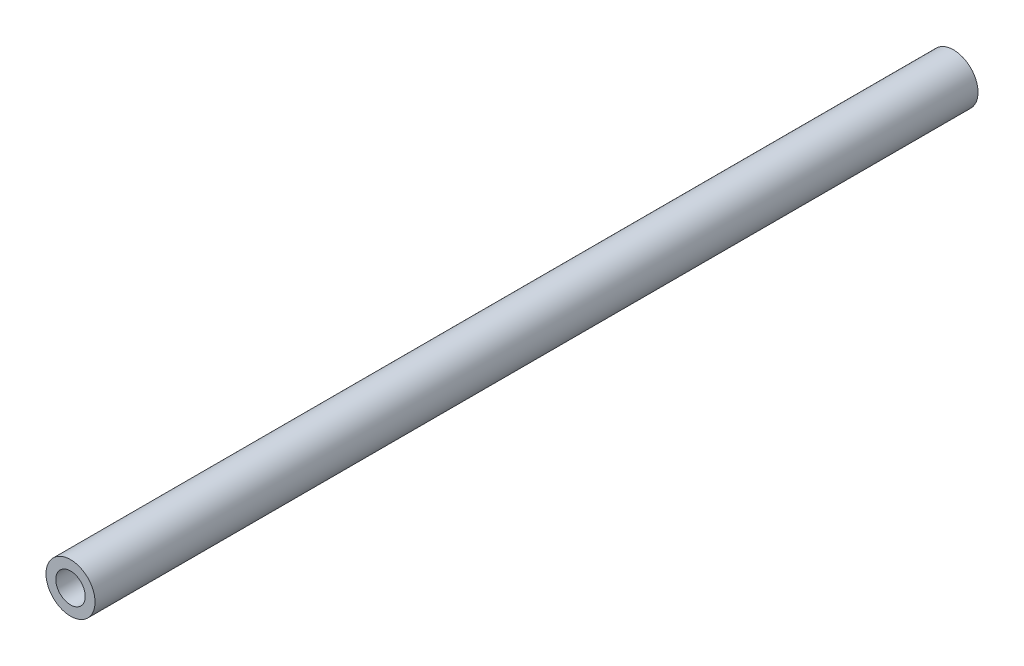
ISO-10303-21;
HEADER;
FILE_DESCRIPTION(('STEP AP214'),'2;1');
FILE_NAME('part.step','',(''),(''),'','','');
FILE_SCHEMA(('AUTOMOTIVE_DESIGN { 1 0 10303 214 1 1 1 1 }'));
ENDSEC;
DATA;
#1=APPLICATION_CONTEXT('core data for automotive mechanical design processes');
#2=APPLICATION_PROTOCOL_DEFINITION('international standard','automotive_design',2000,#1);
#3=PRODUCT_CONTEXT('',#1,'mechanical');
#4=PRODUCT('Part','Part','',(#3));
#5=PRODUCT_RELATED_PRODUCT_CATEGORY('part','',(#4));
#6=PRODUCT_DEFINITION_FORMATION('','',#4);
#7=PRODUCT_DEFINITION_CONTEXT('part definition',#1,'design');
#8=PRODUCT_DEFINITION('design','',#6,#7);
#9=PRODUCT_DEFINITION_SHAPE('','',#8);
#10=(LENGTH_UNIT() NAMED_UNIT(*) SI_UNIT(.MILLI.,.METRE.));
#11=(NAMED_UNIT(*) PLANE_ANGLE_UNIT() SI_UNIT($,.RADIAN.));
#12=(NAMED_UNIT(*) SI_UNIT($,.STERADIAN.) SOLID_ANGLE_UNIT());
#13=UNCERTAINTY_MEASURE_WITH_UNIT(LENGTH_MEASURE(1.E-05),#10,'distance_accuracy_value','');
#14=(GEOMETRIC_REPRESENTATION_CONTEXT(3) GLOBAL_UNCERTAINTY_ASSIGNED_CONTEXT((#13)) GLOBAL_UNIT_ASSIGNED_CONTEXT((#10,
#11,#12)) REPRESENTATION_CONTEXT('',''));
#15=CARTESIAN_POINT('',(0.,0.,0.));
#16=DIRECTION('',(0.,0.,1.));
#17=DIRECTION('',(1.,0.,0.));
#18=AXIS2_PLACEMENT_3D('',#15,#16,#17);
#19=CARTESIAN_POINT('',(0.,0.,90.));
#20=DIRECTION('',(0.,0.,1.));
#21=DIRECTION('',(1.,0.,0.));
#22=AXIS2_PLACEMENT_3D('',#19,#20,#21);
#23=PLANE('',#22);
#24=CARTESIAN_POINT('',(0.,0.,90.));
#25=DIRECTION('',(0.,0.,1.));
#26=DIRECTION('',(1.,0.,0.));
#27=AXIS2_PLACEMENT_3D('',#24,#25,#26);
#28=CIRCLE('',#27,2.5);
#29=CARTESIAN_POINT('',(-2.5,0.,90.));
#30=VERTEX_POINT('',#29);
#31=EDGE_CURVE('E10',#30,#30,#28,.T.);
#32=ORIENTED_EDGE('',*,*,#31,.T.);
#33=EDGE_LOOP('',(#32));
#34=FACE_BOUND('',#33,.T.);
#35=CARTESIAN_POINT('',(0.,0.,90.));
#36=DIRECTION('',(0.,0.,1.));
#37=DIRECTION('',(1.,0.,0.));
#38=AXIS2_PLACEMENT_3D('',#35,#36,#37);
#39=CIRCLE('',#38,1.5);
#40=CARTESIAN_POINT('',(-1.5,0.,90.));
#41=VERTEX_POINT('',#40);
#42=EDGE_CURVE('E51',#41,#41,#39,.T.);
#43=ORIENTED_EDGE('',*,*,#42,.F.);
#44=EDGE_LOOP('',(#43));
#45=FACE_BOUND('',#44,.T.);
#46=ADVANCED_FACE('F40',(#34,#45),#23,.T.);
#47=CARTESIAN_POINT('',(0.,0.,0.));
#48=DIRECTION('',(0.,0.,1.));
#49=DIRECTION('',(1.,0.,0.));
#50=AXIS2_PLACEMENT_3D('',#47,#48,#49);
#51=PLANE('',#50);
#52=CARTESIAN_POINT('',(0.,0.,0.));
#53=DIRECTION('',(0.,0.,1.));
#54=DIRECTION('',(1.,0.,0.));
#55=AXIS2_PLACEMENT_3D('',#52,#53,#54);
#56=CIRCLE('',#55,2.5);
#57=CARTESIAN_POINT('',(-2.5,0.,0.));
#58=VERTEX_POINT('',#57);
#59=EDGE_CURVE('E44',#58,#58,#56,.T.);
#60=ORIENTED_EDGE('',*,*,#59,.F.);
#61=EDGE_LOOP('',(#60));
#62=FACE_BOUND('',#61,.T.);
#63=CARTESIAN_POINT('',(0.,0.,0.));
#64=DIRECTION('',(0.,0.,1.));
#65=DIRECTION('',(1.,0.,0.));
#66=AXIS2_PLACEMENT_3D('',#63,#64,#65);
#67=CIRCLE('',#66,1.5);
#68=CARTESIAN_POINT('',(-1.5,0.,0.));
#69=VERTEX_POINT('',#68);
#70=EDGE_CURVE('E53',#69,#69,#67,.T.);
#71=ORIENTED_EDGE('',*,*,#70,.T.);
#72=EDGE_LOOP('',(#71));
#73=FACE_BOUND('',#72,.T.);
#74=ADVANCED_FACE('F63',(#62,#73),#51,.F.);
#75=CARTESIAN_POINT('',(0.,0.,90.));
#76=DIRECTION('',(0.,0.,-1.));
#77=DIRECTION('',(-1.,0.,0.));
#78=AXIS2_PLACEMENT_3D('',#75,#76,#77);
#79=CYLINDRICAL_SURFACE('',#78,2.5);
#80=CARTESIAN_POINT('',(-2.5,0.,90.));
#81=CARTESIAN_POINT('',(-2.5,0.,89.0625));
#82=CARTESIAN_POINT('',(-2.5,0.,88.125));
#83=CARTESIAN_POINT('',(-2.5,0.,86.25));
#84=CARTESIAN_POINT('',(-2.5,0.,85.3125));
#85=CARTESIAN_POINT('',(-2.5,0.,83.4375));
#86=CARTESIAN_POINT('',(-2.5,0.,82.5));
#87=CARTESIAN_POINT('',(-2.5,0.,80.625));
#88=CARTESIAN_POINT('',(-2.5,0.,79.6875));
#89=CARTESIAN_POINT('',(-2.5,0.,77.8125));
#90=CARTESIAN_POINT('',(-2.5,0.,76.875));
#91=CARTESIAN_POINT('',(-2.5,0.,75.));
#92=CARTESIAN_POINT('',(-2.5,0.,74.0625));
#93=CARTESIAN_POINT('',(-2.5,0.,72.1875));
#94=CARTESIAN_POINT('',(-2.5,0.,71.25));
#95=CARTESIAN_POINT('',(-2.5,0.,69.375));
#96=CARTESIAN_POINT('',(-2.5,0.,68.4375));
#97=CARTESIAN_POINT('',(-2.5,0.,66.5625));
#98=CARTESIAN_POINT('',(-2.5,0.,65.625));
#99=CARTESIAN_POINT('',(-2.5,0.,63.75));
#100=CARTESIAN_POINT('',(-2.5,0.,62.8125));
#101=CARTESIAN_POINT('',(-2.5,0.,60.9375));
#102=CARTESIAN_POINT('',(-2.5,0.,60.));
#103=CARTESIAN_POINT('',(-2.5,0.,58.125));
#104=CARTESIAN_POINT('',(-2.5,0.,57.1875));
#105=CARTESIAN_POINT('',(-2.5,0.,55.3125));
#106=CARTESIAN_POINT('',(-2.5,0.,54.375));
#107=CARTESIAN_POINT('',(-2.5,0.,52.5));
#108=CARTESIAN_POINT('',(-2.5,0.,51.5625));
#109=CARTESIAN_POINT('',(-2.5,0.,49.6875));
#110=CARTESIAN_POINT('',(-2.5,0.,48.75));
#111=CARTESIAN_POINT('',(-2.5,0.,46.875));
#112=CARTESIAN_POINT('',(-2.5,0.,45.9375));
#113=CARTESIAN_POINT('',(-2.5,0.,44.0625));
#114=CARTESIAN_POINT('',(-2.5,0.,43.125));
#115=CARTESIAN_POINT('',(-2.5,0.,41.25));
#116=CARTESIAN_POINT('',(-2.5,0.,40.3125));
#117=CARTESIAN_POINT('',(-2.5,0.,38.4375));
#118=CARTESIAN_POINT('',(-2.5,0.,37.5));
#119=CARTESIAN_POINT('',(-2.5,0.,35.625));
#120=CARTESIAN_POINT('',(-2.5,0.,34.6875));
#121=CARTESIAN_POINT('',(-2.5,0.,32.8125));
#122=CARTESIAN_POINT('',(-2.5,0.,31.875));
#123=CARTESIAN_POINT('',(-2.5,0.,30.));
#124=CARTESIAN_POINT('',(-2.5,0.,29.0625));
#125=CARTESIAN_POINT('',(-2.5,0.,27.1875));
#126=CARTESIAN_POINT('',(-2.5,0.,26.25));
#127=CARTESIAN_POINT('',(-2.5,0.,24.375));
#128=CARTESIAN_POINT('',(-2.5,0.,23.4375));
#129=CARTESIAN_POINT('',(-2.5,0.,21.5625));
#130=CARTESIAN_POINT('',(-2.5,0.,20.625));
#131=CARTESIAN_POINT('',(-2.5,0.,18.75));
#132=CARTESIAN_POINT('',(-2.5,0.,17.8125));
#133=CARTESIAN_POINT('',(-2.5,0.,15.9375));
#134=CARTESIAN_POINT('',(-2.5,0.,15.));
#135=CARTESIAN_POINT('',(-2.5,0.,13.125));
#136=CARTESIAN_POINT('',(-2.5,0.,12.1875));
#137=CARTESIAN_POINT('',(-2.5,0.,10.3125));
#138=CARTESIAN_POINT('',(-2.5,0.,9.37499999999999));
#139=CARTESIAN_POINT('',(-2.5,0.,7.49999999999999));
#140=CARTESIAN_POINT('',(-2.5,0.,6.56249999999999));
#141=CARTESIAN_POINT('',(-2.5,0.,4.68749999999999));
#142=CARTESIAN_POINT('',(-2.5,0.,3.74999999999998));
#143=CARTESIAN_POINT('',(-2.5,0.,1.87499999999998));
#144=CARTESIAN_POINT('',(-2.5,0.,0.937499999999986));
#145=CARTESIAN_POINT('',(-2.5,0.,0.));
#146=B_SPLINE_CURVE_WITH_KNOTS('',3,(#80,#81,#82,#83,#84,#85,#86,#87,#88,#89,#90,#91,#92,#93,
#94,#95,#96,#97,#98,#99,#100,#101,#102,#103,#104,#105,#106,#107,#108,#109,#110,#111,#112,#113,
#114,#115,#116,#117,#118,#119,#120,#121,#122,#123,#124,#125,#126,#127,#128,#129,#130,#131,#132,
#133,#134,#135,#136,#137,#138,#139,#140,#141,#142,#143,#144,#145),.UNSPECIFIED.,.F.,.F.,(4,2,2,
2,2,2,2,2,2,2,2,2,2,2,2,2,2,2,2,2,2,2,2,2,2,2,2,2,2,2,2,2,4),(0.,2.81250000000001,
5.62500000000001,8.43750000000001,11.25,14.0625,16.875,19.6875,22.5,25.3125,28.125,30.9375,
33.75,36.5625,39.375,42.1875,45.,47.8125,50.625,53.4375,56.25,59.0625,61.875,64.6875,67.5,
70.3125,73.125,75.9375,78.75,81.5625,84.375,87.1875,90.),.UNSPECIFIED.);
#147=EDGE_CURVE('BSEAM42',#30,#58,#146,.T.);
#148=ORIENTED_EDGE('',*,*,#31,.F.);
#149=ORIENTED_EDGE('',*,*,#59,.T.);
#150=ORIENTED_EDGE('',*,*,#147,.T.);
#151=ORIENTED_EDGE('',*,*,#147,.F.);
#152=EDGE_LOOP('',(#148,#150,#149,#151));
#153=FACE_BOUND('',#152,.T.);
#154=ADVANCED_FACE('F42',(#153),#79,.T.);
#155=CARTESIAN_POINT('',(0.,0.,90.));
#156=DIRECTION('',(0.,0.,-1.));
#157=DIRECTION('',(-1.,0.,0.));
#158=AXIS2_PLACEMENT_3D('',#155,#156,#157);
#159=CYLINDRICAL_SURFACE('',#158,1.5);
#160=CARTESIAN_POINT('',(-1.5,0.,90.));
#161=CARTESIAN_POINT('',(-1.5,0.,89.0625));
#162=CARTESIAN_POINT('',(-1.5,0.,88.125));
#163=CARTESIAN_POINT('',(-1.5,0.,86.25));
#164=CARTESIAN_POINT('',(-1.5,0.,85.3125));
#165=CARTESIAN_POINT('',(-1.5,0.,83.4375));
#166=CARTESIAN_POINT('',(-1.5,0.,82.5));
#167=CARTESIAN_POINT('',(-1.5,0.,80.625));
#168=CARTESIAN_POINT('',(-1.5,0.,79.6875));
#169=CARTESIAN_POINT('',(-1.5,0.,77.8125));
#170=CARTESIAN_POINT('',(-1.5,0.,76.875));
#171=CARTESIAN_POINT('',(-1.5,0.,75.));
#172=CARTESIAN_POINT('',(-1.5,0.,74.0625));
#173=CARTESIAN_POINT('',(-1.5,0.,72.1875));
#174=CARTESIAN_POINT('',(-1.5,0.,71.25));
#175=CARTESIAN_POINT('',(-1.5,0.,69.375));
#176=CARTESIAN_POINT('',(-1.5,0.,68.4375));
#177=CARTESIAN_POINT('',(-1.5,0.,66.5625));
#178=CARTESIAN_POINT('',(-1.5,0.,65.625));
#179=CARTESIAN_POINT('',(-1.5,0.,63.75));
#180=CARTESIAN_POINT('',(-1.5,0.,62.8125));
#181=CARTESIAN_POINT('',(-1.5,0.,60.9375));
#182=CARTESIAN_POINT('',(-1.5,0.,60.));
#183=CARTESIAN_POINT('',(-1.5,0.,58.125));
#184=CARTESIAN_POINT('',(-1.5,0.,57.1875));
#185=CARTESIAN_POINT('',(-1.5,0.,55.3125));
#186=CARTESIAN_POINT('',(-1.5,0.,54.375));
#187=CARTESIAN_POINT('',(-1.5,0.,52.5));
#188=CARTESIAN_POINT('',(-1.5,0.,51.5625));
#189=CARTESIAN_POINT('',(-1.5,0.,49.6875));
#190=CARTESIAN_POINT('',(-1.5,0.,48.75));
#191=CARTESIAN_POINT('',(-1.5,0.,46.875));
#192=CARTESIAN_POINT('',(-1.5,0.,45.9375));
#193=CARTESIAN_POINT('',(-1.5,0.,44.0625));
#194=CARTESIAN_POINT('',(-1.5,0.,43.125));
#195=CARTESIAN_POINT('',(-1.5,0.,41.25));
#196=CARTESIAN_POINT('',(-1.5,0.,40.3125));
#197=CARTESIAN_POINT('',(-1.5,0.,38.4375));
#198=CARTESIAN_POINT('',(-1.5,0.,37.5));
#199=CARTESIAN_POINT('',(-1.5,0.,35.625));
#200=CARTESIAN_POINT('',(-1.5,0.,34.6875));
#201=CARTESIAN_POINT('',(-1.5,0.,32.8125));
#202=CARTESIAN_POINT('',(-1.5,0.,31.875));
#203=CARTESIAN_POINT('',(-1.5,0.,30.));
#204=CARTESIAN_POINT('',(-1.5,0.,29.0625));
#205=CARTESIAN_POINT('',(-1.5,0.,27.1875));
#206=CARTESIAN_POINT('',(-1.5,0.,26.25));
#207=CARTESIAN_POINT('',(-1.5,0.,24.375));
#208=CARTESIAN_POINT('',(-1.5,0.,23.4375));
#209=CARTESIAN_POINT('',(-1.5,0.,21.5625));
#210=CARTESIAN_POINT('',(-1.5,0.,20.625));
#211=CARTESIAN_POINT('',(-1.5,0.,18.75));
#212=CARTESIAN_POINT('',(-1.5,0.,17.8125));
#213=CARTESIAN_POINT('',(-1.5,0.,15.9375));
#214=CARTESIAN_POINT('',(-1.5,0.,15.));
#215=CARTESIAN_POINT('',(-1.5,0.,13.125));
#216=CARTESIAN_POINT('',(-1.5,0.,12.1875));
#217=CARTESIAN_POINT('',(-1.5,0.,10.3125));
#218=CARTESIAN_POINT('',(-1.5,0.,9.37499999999999));
#219=CARTESIAN_POINT('',(-1.5,0.,7.49999999999999));
#220=CARTESIAN_POINT('',(-1.5,0.,6.56249999999999));
#221=CARTESIAN_POINT('',(-1.5,0.,4.68749999999999));
#222=CARTESIAN_POINT('',(-1.5,0.,3.74999999999998));
#223=CARTESIAN_POINT('',(-1.5,0.,1.87499999999998));
#224=CARTESIAN_POINT('',(-1.5,0.,0.937499999999986));
#225=CARTESIAN_POINT('',(-1.5,0.,0.));
#226=B_SPLINE_CURVE_WITH_KNOTS('',3,(#160,#161,#162,#163,#164,#165,#166,#167,#168,#169,#170,
#171,#172,#173,#174,#175,#176,#177,#178,#179,#180,#181,#182,#183,#184,#185,#186,#187,#188,#189,
#190,#191,#192,#193,#194,#195,#196,#197,#198,#199,#200,#201,#202,#203,#204,#205,#206,#207,#208,
#209,#210,#211,#212,#213,#214,#215,#216,#217,#218,#219,#220,#221,#222,#223,#224,#225),
.UNSPECIFIED.,.F.,.F.,(4,2,2,2,2,2,2,2,2,2,2,2,2,2,2,2,2,2,2,2,2,2,2,2,2,2,2,2,2,2,2,2,4),(0.,
2.81250000000001,5.62500000000001,8.43750000000001,11.25,14.0625,16.875,19.6875,22.5,25.3125,
28.125,30.9375,33.75,36.5625,39.375,42.1875,45.,47.8125,50.625,53.4375,56.25,59.0625,61.875,
64.6875,67.5,70.3125,73.125,75.9375,78.75,81.5625,84.375,87.1875,90.),.UNSPECIFIED.);
#227=EDGE_CURVE('BSEAM59',#41,#69,#226,.T.);
#228=ORIENTED_EDGE('',*,*,#42,.T.);
#229=ORIENTED_EDGE('',*,*,#70,.F.);
#230=ORIENTED_EDGE('',*,*,#227,.T.);
#231=ORIENTED_EDGE('',*,*,#227,.F.);
#232=EDGE_LOOP('',(#228,#230,#229,#231));
#233=FACE_BOUND('',#232,.T.);
#234=ADVANCED_FACE('F59',(#233),#159,.F.);
#235=CLOSED_SHELL('',(#46,#74,#154,#234));
#236=MANIFOLD_SOLID_BREP('B2',#235);
#237=ADVANCED_BREP_SHAPE_REPRESENTATION('',(#18,#236),#14);
#238=SHAPE_DEFINITION_REPRESENTATION(#9,#237);
ENDSEC;
END-ISO-10303-21;
